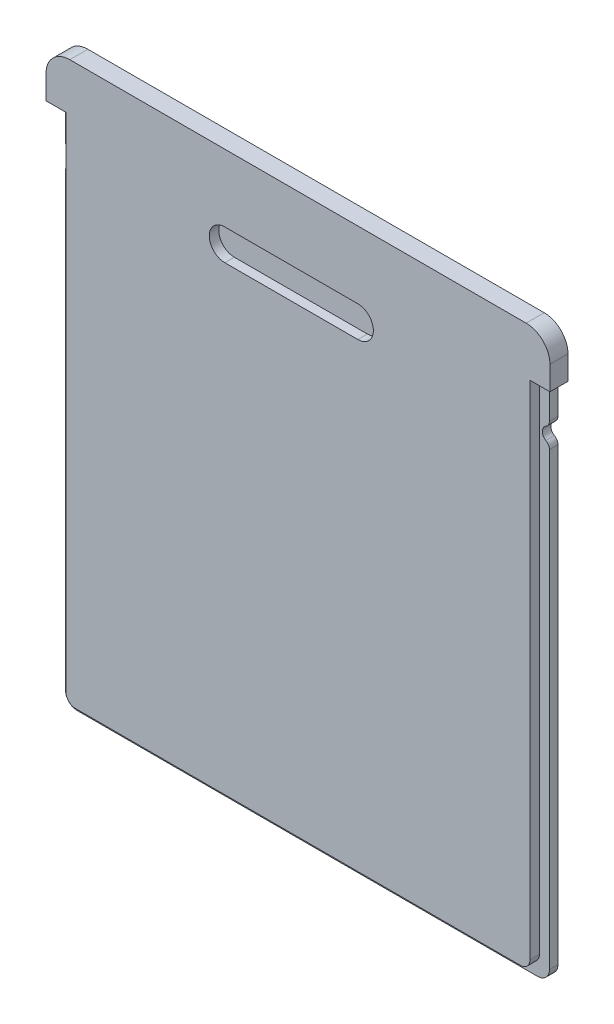
ISO-10303-21;
HEADER;
FILE_DESCRIPTION(('STEP AP214'),'2;1');
FILE_NAME('part.step','',(''),(''),'','','');
FILE_SCHEMA(('AUTOMOTIVE_DESIGN { 1 0 10303 214 1 1 1 1 }'));
ENDSEC;
DATA;
#1=APPLICATION_CONTEXT('core data for automotive mechanical design processes');
#2=APPLICATION_PROTOCOL_DEFINITION('international standard','automotive_design',2000,#1);
#3=PRODUCT_CONTEXT('',#1,'mechanical');
#4=PRODUCT('Part','Part','',(#3));
#5=PRODUCT_RELATED_PRODUCT_CATEGORY('part','',(#4));
#6=PRODUCT_DEFINITION_FORMATION('','',#4);
#7=PRODUCT_DEFINITION_CONTEXT('part definition',#1,'design');
#8=PRODUCT_DEFINITION('design','',#6,#7);
#9=PRODUCT_DEFINITION_SHAPE('','',#8);
#10=(LENGTH_UNIT() NAMED_UNIT(*) SI_UNIT(.MILLI.,.METRE.));
#11=(NAMED_UNIT(*) PLANE_ANGLE_UNIT() SI_UNIT($,.RADIAN.));
#12=(NAMED_UNIT(*) SI_UNIT($,.STERADIAN.) SOLID_ANGLE_UNIT());
#13=UNCERTAINTY_MEASURE_WITH_UNIT(LENGTH_MEASURE(1.E-05),#10,'distance_accuracy_value','');
#14=(GEOMETRIC_REPRESENTATION_CONTEXT(3) GLOBAL_UNCERTAINTY_ASSIGNED_CONTEXT((#13)) GLOBAL_UNIT_ASSIGNED_CONTEXT((#10,
#11,#12)) REPRESENTATION_CONTEXT('',''));
#15=CARTESIAN_POINT('',(0.,0.,0.));
#16=DIRECTION('',(0.,0.,1.));
#17=DIRECTION('',(1.,0.,0.));
#18=AXIS2_PLACEMENT_3D('',#15,#16,#17);
#19=CARTESIAN_POINT('',(101.8,2.5,1.8));
#20=DIRECTION('',(-1.,0.,0.));
#21=DIRECTION('',(0.,0.,1.));
#22=AXIS2_PLACEMENT_3D('',#19,#20,#21);
#23=PLANE('',#22);
#24=DIRECTION('',(0.,1.,0.));
#25=VECTOR('',#24,1.);
#26=CARTESIAN_POINT('',(101.8,2.5,1.8));
#27=LINE('',#26,#25);
#28=CARTESIAN_POINT('',(101.8,102.398076211353,1.8));
#29=VERTEX_POINT('',#28);
#30=CARTESIAN_POINT('',(101.8,109.8,1.8));
#31=VERTEX_POINT('',#30);
#32=EDGE_CURVE('E392',#29,#31,#27,.T.);
#33=ORIENTED_EDGE('',*,*,#32,.F.);
#34=DIRECTION('',(0.,0.,-1.));
#35=VECTOR('',#34,1.);
#36=CARTESIAN_POINT('',(101.8,102.398076211353,1.8));
#37=LINE('',#36,#35);
#38=CARTESIAN_POINT('',(101.8,102.398076211353,0.));
#39=VERTEX_POINT('',#38);
#40=EDGE_CURVE('E511',#29,#39,#37,.T.);
#41=ORIENTED_EDGE('',*,*,#40,.T.);
#42=DIRECTION('',(0.,1.,0.));
#43=VECTOR('',#42,1.);
#44=CARTESIAN_POINT('',(101.8,2.5,0.));
#45=LINE('',#44,#43);
#46=CARTESIAN_POINT('',(101.8,109.8,0.));
#47=VERTEX_POINT('',#46);
#48=EDGE_CURVE('E413',#39,#47,#45,.T.);
#49=ORIENTED_EDGE('',*,*,#48,.T.);
#50=DIRECTION('',(0.,0.,-1.));
#51=VECTOR('',#50,1.);
#52=CARTESIAN_POINT('',(101.8,109.8,1.8));
#53=LINE('',#52,#51);
#54=EDGE_CURVE('E467',#31,#47,#53,.T.);
#55=ORIENTED_EDGE('',*,*,#54,.F.);
#56=EDGE_LOOP('',(#33,#41,#49,#55));
#57=FACE_BOUND('',#56,.T.);
#58=ADVANCED_FACE('F45',(#57),#23,.F.);
#59=CARTESIAN_POINT('',(0.,2.5,1.8));
#60=DIRECTION('',(1.,0.,0.));
#61=DIRECTION('',(0.,0.,-1.));
#62=AXIS2_PLACEMENT_3D('',#59,#60,#61);
#63=PLANE('',#62);
#64=DIRECTION('',(0.,-1.,0.));
#65=VECTOR('',#64,1.);
#66=CARTESIAN_POINT('',(0.,2.5,1.8));
#67=LINE('',#66,#65);
#68=CARTESIAN_POINT('',(0.,97.2019237886467,1.8));
#69=VERTEX_POINT('',#68);
#70=CARTESIAN_POINT('',(0.,2.5,1.8));
#71=VERTEX_POINT('',#70);
#72=EDGE_CURVE('E398',#69,#71,#67,.T.);
#73=ORIENTED_EDGE('',*,*,#72,.F.);
#74=DIRECTION('',(0.,0.,-1.));
#75=VECTOR('',#74,1.);
#76=CARTESIAN_POINT('',(0.,97.2019237886467,1.8));
#77=LINE('',#76,#75);
#78=CARTESIAN_POINT('',(0.,97.2019237886467,0.));
#79=VERTEX_POINT('',#78);
#80=EDGE_CURVE('E515',#69,#79,#77,.T.);
#81=ORIENTED_EDGE('',*,*,#80,.T.);
#82=DIRECTION('',(0.,-1.,0.));
#83=VECTOR('',#82,1.);
#84=CARTESIAN_POINT('',(0.,2.5,0.));
#85=LINE('',#84,#83);
#86=CARTESIAN_POINT('',(0.,2.5,0.));
#87=VERTEX_POINT('',#86);
#88=EDGE_CURVE('E434',#79,#87,#85,.T.);
#89=ORIENTED_EDGE('',*,*,#88,.T.);
#90=DIRECTION('',(0.,0.,-1.));
#91=VECTOR('',#90,1.);
#92=CARTESIAN_POINT('',(0.,2.5,1.8));
#93=LINE('',#92,#91);
#94=EDGE_CURVE('E451',#71,#87,#93,.T.);
#95=ORIENTED_EDGE('',*,*,#94,.F.);
#96=EDGE_LOOP('',(#73,#81,#89,#95));
#97=FACE_BOUND('',#96,.T.);
#98=ADVANCED_FACE('F602',(#97),#63,.F.);
#99=CARTESIAN_POINT('',(99.3,2.5,1.8));
#100=DIRECTION('',(0.,0.,-1.));
#101=DIRECTION('',(-1.,0.,0.));
#102=AXIS2_PLACEMENT_3D('',#99,#100,#101);
#103=CYLINDRICAL_SURFACE('',#102,2.5);
#104=CARTESIAN_POINT('',(99.3,2.5,0.));
#105=DIRECTION('',(0.,0.,1.));
#106=DIRECTION('',(1.,0.,0.));
#107=AXIS2_PLACEMENT_3D('',#104,#105,#106);
#108=CIRCLE('',#107,2.5);
#109=CARTESIAN_POINT('',(99.3,0.,0.));
#110=VERTEX_POINT('',#109);
#111=CARTESIAN_POINT('',(101.8,2.5,0.));
#112=VERTEX_POINT('',#111);
#113=EDGE_CURVE('E387',#110,#112,#108,.T.);
#114=ORIENTED_EDGE('',*,*,#113,.T.);
#115=DIRECTION('',(0.,0.,-1.));
#116=VECTOR('',#115,1.);
#117=CARTESIAN_POINT('',(101.8,2.5,1.8));
#118=LINE('',#117,#116);
#119=CARTESIAN_POINT('',(101.8,2.5,1.8));
#120=VERTEX_POINT('',#119);
#121=EDGE_CURVE('E342',#120,#112,#118,.T.);
#122=ORIENTED_EDGE('',*,*,#121,.F.);
#123=CARTESIAN_POINT('',(99.3,2.5,1.8));
#124=DIRECTION('',(0.,0.,1.));
#125=DIRECTION('',(1.,0.,0.));
#126=AXIS2_PLACEMENT_3D('',#123,#124,#125);
#127=CIRCLE('',#126,2.5);
#128=CARTESIAN_POINT('',(99.3,0.,1.8));
#129=VERTEX_POINT('',#128);
#130=EDGE_CURVE('E388',#129,#120,#127,.T.);
#131=ORIENTED_EDGE('',*,*,#130,.F.);
#132=DIRECTION('',(0.,0.,-1.));
#133=VECTOR('',#132,1.);
#134=CARTESIAN_POINT('',(99.3,0.,1.8));
#135=LINE('',#134,#133);
#136=EDGE_CURVE('E409',#129,#110,#135,.T.);
#137=ORIENTED_EDGE('',*,*,#136,.T.);
#138=EDGE_LOOP('',(#114,#122,#131,#137));
#139=FACE_BOUND('',#138,.T.);
#140=ADVANCED_FACE('F615',(#139),#103,.T.);
#141=CARTESIAN_POINT('',(101.8,97.2019237886467,0.));
#142=VERTEX_POINT('',#141);
#143=EDGE_CURVE('E414',#112,#142,#45,.T.);
#144=ORIENTED_EDGE('',*,*,#143,.T.);
#145=DIRECTION('',(0.,0.,-1.));
#146=VECTOR('',#145,1.);
#147=CARTESIAN_POINT('',(101.8,97.2019237886467,1.8));
#148=LINE('',#147,#146);
#149=CARTESIAN_POINT('',(101.8,97.2019237886467,1.8));
#150=VERTEX_POINT('',#149);
#151=EDGE_CURVE('E477',#142,#150,#148,.F.);
#152=ORIENTED_EDGE('',*,*,#151,.T.);
#153=EDGE_CURVE('E394',#120,#150,#27,.T.);
#154=ORIENTED_EDGE('',*,*,#153,.F.);
#155=ORIENTED_EDGE('',*,*,#121,.T.);
#156=EDGE_LOOP('',(#144,#152,#154,#155));
#157=FACE_BOUND('',#156,.T.);
#158=ADVANCED_FACE('F618',(#157),#23,.F.);
#159=CARTESIAN_POINT('',(101.8,109.8,1.8));
#160=DIRECTION('',(0.,1.,0.));
#161=DIRECTION('',(0.,0.,1.));
#162=AXIS2_PLACEMENT_3D('',#159,#160,#161);
#163=PLANE('',#162);
#164=DIRECTION('',(1.,0.,0.));
#165=VECTOR('',#164,1.);
#166=CARTESIAN_POINT('',(101.8,109.8,0.));
#167=LINE('',#166,#165);
#168=CARTESIAN_POINT('',(103.9,109.8,0.));
#169=VERTEX_POINT('',#168);
#170=EDGE_CURVE('E418',#47,#169,#167,.T.);
#171=ORIENTED_EDGE('',*,*,#170,.T.);
#172=DIRECTION('',(0.,0.,-1.));
#173=VECTOR('',#172,1.);
#174=CARTESIAN_POINT('',(103.9,109.8,1.8));
#175=LINE('',#174,#173);
#176=CARTESIAN_POINT('',(103.9,109.8,3.8));
#177=VERTEX_POINT('',#176);
#178=EDGE_CURVE('E463',#177,#169,#175,.T.);
#179=ORIENTED_EDGE('',*,*,#178,.F.);
#180=DIRECTION('',(1.,0.,0.));
#181=VECTOR('',#180,1.);
#182=CARTESIAN_POINT('',(99.7,109.8,3.8));
#183=LINE('',#182,#181);
#184=CARTESIAN_POINT('',(99.7,109.8,3.8));
#185=VERTEX_POINT('',#184);
#186=EDGE_CURVE('E323',#185,#177,#183,.T.);
#187=ORIENTED_EDGE('',*,*,#186,.F.);
#188=DIRECTION('',(0.,0.,-1.));
#189=VECTOR('',#188,1.);
#190=CARTESIAN_POINT('',(99.7,109.8,3.8));
#191=LINE('',#190,#189);
#192=CARTESIAN_POINT('',(99.7,109.8,1.8));
#193=VERTEX_POINT('',#192);
#194=EDGE_CURVE('E336',#185,#193,#191,.T.);
#195=ORIENTED_EDGE('',*,*,#194,.T.);
#196=DIRECTION('',(1.,0.,0.));
#197=VECTOR('',#196,1.);
#198=CARTESIAN_POINT('',(99.7,109.8,1.8));
#199=LINE('',#198,#197);
#200=EDGE_CURVE('E307',#193,#31,#199,.T.);
#201=ORIENTED_EDGE('',*,*,#200,.T.);
#202=ORIENTED_EDGE('',*,*,#54,.T.);
#203=EDGE_LOOP('',(#171,#179,#187,#195,#201,#202));
#204=FACE_BOUND('',#203,.T.);
#205=ADVANCED_FACE('F574',(#204),#163,.F.);
#206=CARTESIAN_POINT('',(103.9,119.8,1.8));
#207=DIRECTION('',(-1.,0.,0.));
#208=DIRECTION('',(0.,0.,1.));
#209=AXIS2_PLACEMENT_3D('',#206,#207,#208);
#210=PLANE('',#209);
#211=DIRECTION('',(0.,1.,0.));
#212=VECTOR('',#211,1.);
#213=CARTESIAN_POINT('',(103.9,119.8,0.));
#214=LINE('',#213,#212);
#215=CARTESIAN_POINT('',(103.9,114.8,0.));
#216=VERTEX_POINT('',#215);
#217=EDGE_CURVE('E421',#169,#216,#214,.T.);
#218=ORIENTED_EDGE('',*,*,#217,.T.);
#219=DIRECTION('',(0.,0.,-1.));
#220=VECTOR('',#219,1.);
#221=CARTESIAN_POINT('',(103.9,114.8,1.8));
#222=LINE('',#221,#220);
#223=CARTESIAN_POINT('',(103.9,114.8,3.8));
#224=VERTEX_POINT('',#223);
#225=EDGE_CURVE('E11',#216,#224,#222,.F.);
#226=ORIENTED_EDGE('',*,*,#225,.T.);
#227=DIRECTION('',(0.,-1.,0.));
#228=VECTOR('',#227,1.);
#229=CARTESIAN_POINT('',(103.9,119.8,3.8));
#230=LINE('',#229,#228);
#231=EDGE_CURVE('E327',#224,#177,#230,.T.);
#232=ORIENTED_EDGE('',*,*,#231,.T.);
#233=ORIENTED_EDGE('',*,*,#178,.T.);
#234=EDGE_LOOP('',(#218,#226,#232,#233));
#235=FACE_BOUND('',#234,.T.);
#236=ADVANCED_FACE('F570',(#235),#210,.F.);
#237=CARTESIAN_POINT('',(-2.10000000000002,119.8,1.8));
#238=DIRECTION('',(0.,-1.,0.));
#239=DIRECTION('',(1.,0.,0.));
#240=AXIS2_PLACEMENT_3D('',#237,#238,#239);
#241=PLANE('',#240);
#242=DIRECTION('',(-1.,0.,0.));
#243=VECTOR('',#242,1.);
#244=CARTESIAN_POINT('',(-2.10000000000002,119.8,0.));
#245=LINE('',#244,#243);
#246=CARTESIAN_POINT('',(98.9,119.8,0.));
#247=VERTEX_POINT('',#246);
#248=CARTESIAN_POINT('',(2.89999999999998,119.8,0.));
#249=VERTEX_POINT('',#248);
#250=EDGE_CURVE('E424',#247,#249,#245,.T.);
#251=ORIENTED_EDGE('',*,*,#250,.T.);
#252=DIRECTION('',(0.,0.,-1.));
#253=VECTOR('',#252,1.);
#254=CARTESIAN_POINT('',(2.89999999999998,119.8,1.8));
#255=LINE('',#254,#253);
#256=CARTESIAN_POINT('',(2.89999999999998,119.8,3.8));
#257=VERTEX_POINT('',#256);
#258=EDGE_CURVE('E543',#249,#257,#255,.F.);
#259=ORIENTED_EDGE('',*,*,#258,.T.);
#260=DIRECTION('',(1.,0.,0.));
#261=VECTOR('',#260,1.);
#262=CARTESIAN_POINT('',(-2.10000000000002,119.8,3.8));
#263=LINE('',#262,#261);
#264=CARTESIAN_POINT('',(98.9,119.8,3.8));
#265=VERTEX_POINT('',#264);
#266=EDGE_CURVE('E330',#257,#265,#263,.T.);
#267=ORIENTED_EDGE('',*,*,#266,.T.);
#268=DIRECTION('',(0.,0.,-1.));
#269=VECTOR('',#268,1.);
#270=CARTESIAN_POINT('',(98.9,119.8,1.8));
#271=LINE('',#270,#269);
#272=EDGE_CURVE('E539',#265,#247,#271,.T.);
#273=ORIENTED_EDGE('',*,*,#272,.T.);
#274=EDGE_LOOP('',(#251,#259,#267,#273));
#275=FACE_BOUND('',#274,.T.);
#276=ADVANCED_FACE('F565',(#275),#241,.F.);
#277=CARTESIAN_POINT('',(-2.10000000000002,119.8,1.8));
#278=DIRECTION('',(1.,0.,0.));
#279=DIRECTION('',(0.,1.,0.));
#280=AXIS2_PLACEMENT_3D('',#277,#278,#279);
#281=PLANE('',#280);
#282=DIRECTION('',(0.,-1.,0.));
#283=VECTOR('',#282,1.);
#284=CARTESIAN_POINT('',(-2.10000000000002,119.8,3.8));
#285=LINE('',#284,#283);
#286=CARTESIAN_POINT('',(-2.10000000000002,114.8,3.8));
#287=VERTEX_POINT('',#286);
#288=CARTESIAN_POINT('',(-2.10000000000001,109.8,3.8));
#289=VERTEX_POINT('',#288);
#290=EDGE_CURVE('E333',#287,#289,#285,.T.);
#291=ORIENTED_EDGE('',*,*,#290,.F.);
#292=DIRECTION('',(0.,0.,-1.));
#293=VECTOR('',#292,1.);
#294=CARTESIAN_POINT('',(-2.10000000000002,114.8,1.8));
#295=LINE('',#294,#293);
#296=CARTESIAN_POINT('',(-2.10000000000002,114.8,0.));
#297=VERTEX_POINT('',#296);
#298=EDGE_CURVE('E529',#287,#297,#295,.T.);
#299=ORIENTED_EDGE('',*,*,#298,.T.);
#300=DIRECTION('',(0.,-1.,0.));
#301=VECTOR('',#300,1.);
#302=CARTESIAN_POINT('',(-2.10000000000002,119.8,0.));
#303=LINE('',#302,#301);
#304=CARTESIAN_POINT('',(-2.10000000000001,109.8,0.));
#305=VERTEX_POINT('',#304);
#306=EDGE_CURVE('E428',#297,#305,#303,.T.);
#307=ORIENTED_EDGE('',*,*,#306,.T.);
#308=DIRECTION('',(0.,0.,-1.));
#309=VECTOR('',#308,1.);
#310=CARTESIAN_POINT('',(-2.10000000000001,109.8,1.8));
#311=LINE('',#310,#309);
#312=EDGE_CURVE('E459',#289,#305,#311,.T.);
#313=ORIENTED_EDGE('',*,*,#312,.F.);
#314=EDGE_LOOP('',(#291,#299,#307,#313));
#315=FACE_BOUND('',#314,.T.);
#316=ADVANCED_FACE('F556',(#315),#281,.F.);
#317=CARTESIAN_POINT('',(-2.10000000000001,109.8,1.8));
#318=DIRECTION('',(0.,1.,0.));
#319=DIRECTION('',(0.,0.,1.));
#320=AXIS2_PLACEMENT_3D('',#317,#318,#319);
#321=PLANE('',#320);
#322=DIRECTION('',(1.,0.,0.));
#323=VECTOR('',#322,1.);
#324=CARTESIAN_POINT('',(-2.10000000000001,109.8,0.));
#325=LINE('',#324,#323);
#326=CARTESIAN_POINT('',(0.,109.8,0.));
#327=VERTEX_POINT('',#326);
#328=EDGE_CURVE('E431',#305,#327,#325,.T.);
#329=ORIENTED_EDGE('',*,*,#328,.T.);
#330=DIRECTION('',(0.,0.,-1.));
#331=VECTOR('',#330,1.);
#332=CARTESIAN_POINT('',(0.,109.8,1.8));
#333=LINE('',#332,#331);
#334=CARTESIAN_POINT('',(0.,109.8,1.8));
#335=VERTEX_POINT('',#334);
#336=EDGE_CURVE('E455',#335,#327,#333,.T.);
#337=ORIENTED_EDGE('',*,*,#336,.F.);
#338=DIRECTION('',(1.,0.,0.));
#339=VECTOR('',#338,1.);
#340=CARTESIAN_POINT('',(-2.10000000000001,109.8,1.8));
#341=LINE('',#340,#339);
#342=CARTESIAN_POINT('',(2.1,109.8,1.8));
#343=VERTEX_POINT('',#342);
#344=EDGE_CURVE('E337',#335,#343,#341,.T.);
#345=ORIENTED_EDGE('',*,*,#344,.T.);
#346=DIRECTION('',(0.,0.,-1.));
#347=VECTOR('',#346,1.);
#348=CARTESIAN_POINT('',(2.1,109.8,3.8));
#349=LINE('',#348,#347);
#350=CARTESIAN_POINT('',(2.1,109.8,3.8));
#351=VERTEX_POINT('',#350);
#352=EDGE_CURVE('E383',#351,#343,#349,.T.);
#353=ORIENTED_EDGE('',*,*,#352,.F.);
#354=DIRECTION('',(1.,0.,0.));
#355=VECTOR('',#354,1.);
#356=CARTESIAN_POINT('',(-2.10000000000001,109.8,3.8));
#357=LINE('',#356,#355);
#358=EDGE_CURVE('E302',#289,#351,#357,.T.);
#359=ORIENTED_EDGE('',*,*,#358,.F.);
#360=ORIENTED_EDGE('',*,*,#312,.T.);
#361=EDGE_LOOP('',(#329,#337,#345,#353,#359,#360));
#362=FACE_BOUND('',#361,.T.);
#363=ADVANCED_FACE('F698',(#362),#321,.F.);
#364=CARTESIAN_POINT('',(0.,102.398076211353,0.));
#365=VERTEX_POINT('',#364);
#366=EDGE_CURVE('E435',#327,#365,#85,.T.);
#367=ORIENTED_EDGE('',*,*,#366,.T.);
#368=DIRECTION('',(0.,0.,-1.));
#369=VECTOR('',#368,1.);
#370=CARTESIAN_POINT('',(0.,102.398076211353,1.8));
#371=LINE('',#370,#369);
#372=CARTESIAN_POINT('',(0.,102.398076211353,1.8));
#373=VERTEX_POINT('',#372);
#374=EDGE_CURVE('E525',#365,#373,#371,.F.);
#375=ORIENTED_EDGE('',*,*,#374,.T.);
#376=EDGE_CURVE('E399',#335,#373,#67,.T.);
#377=ORIENTED_EDGE('',*,*,#376,.F.);
#378=ORIENTED_EDGE('',*,*,#336,.T.);
#379=EDGE_LOOP('',(#367,#375,#377,#378));
#380=FACE_BOUND('',#379,.T.);
#381=ADVANCED_FACE('F660',(#380),#63,.F.);
#382=CARTESIAN_POINT('',(2.5,2.5,1.8));
#383=DIRECTION('',(0.,0.,-1.));
#384=DIRECTION('',(-1.,0.,0.));
#385=AXIS2_PLACEMENT_3D('',#382,#383,#384);
#386=CYLINDRICAL_SURFACE('',#385,2.5);
#387=CARTESIAN_POINT('',(2.5,2.5,0.));
#388=DIRECTION('',(0.,0.,1.));
#389=DIRECTION('',(-1.,0.,0.));
#390=AXIS2_PLACEMENT_3D('',#387,#388,#389);
#391=CIRCLE('',#390,2.5);
#392=CARTESIAN_POINT('',(2.5,0.,0.));
#393=VERTEX_POINT('',#392);
#394=EDGE_CURVE('E439',#87,#393,#391,.T.);
#395=ORIENTED_EDGE('',*,*,#394,.T.);
#396=DIRECTION('',(0.,0.,-1.));
#397=VECTOR('',#396,1.);
#398=CARTESIAN_POINT('',(2.5,0.,1.8));
#399=LINE('',#398,#397);
#400=CARTESIAN_POINT('',(2.5,0.,1.8));
#401=VERTEX_POINT('',#400);
#402=EDGE_CURVE('E447',#401,#393,#399,.T.);
#403=ORIENTED_EDGE('',*,*,#402,.F.);
#404=CARTESIAN_POINT('',(2.5,2.5,1.8));
#405=DIRECTION('',(0.,0.,1.));
#406=DIRECTION('',(-1.,0.,0.));
#407=AXIS2_PLACEMENT_3D('',#404,#405,#406);
#408=CIRCLE('',#407,2.5);
#409=EDGE_CURVE('E403',#71,#401,#408,.T.);
#410=ORIENTED_EDGE('',*,*,#409,.F.);
#411=ORIENTED_EDGE('',*,*,#94,.T.);
#412=EDGE_LOOP('',(#395,#403,#410,#411));
#413=FACE_BOUND('',#412,.T.);
#414=ADVANCED_FACE('F606',(#413),#386,.T.);
#415=CARTESIAN_POINT('',(2.5,0.,1.8));
#416=DIRECTION('',(0.,1.,0.));
#417=DIRECTION('',(0.,0.,1.));
#418=AXIS2_PLACEMENT_3D('',#415,#416,#417);
#419=PLANE('',#418);
#420=DIRECTION('',(1.,0.,0.));
#421=VECTOR('',#420,1.);
#422=CARTESIAN_POINT('',(2.5,0.,0.));
#423=LINE('',#422,#421);
#424=EDGE_CURVE('E393',#393,#110,#423,.T.);
#425=ORIENTED_EDGE('',*,*,#424,.T.);
#426=ORIENTED_EDGE('',*,*,#136,.F.);
#427=DIRECTION('',(1.,0.,0.));
#428=VECTOR('',#427,1.);
#429=CARTESIAN_POINT('',(2.5,0.,1.8));
#430=LINE('',#429,#428);
#431=EDGE_CURVE('E406',#401,#129,#430,.T.);
#432=ORIENTED_EDGE('',*,*,#431,.F.);
#433=ORIENTED_EDGE('',*,*,#402,.T.);
#434=EDGE_LOOP('',(#425,#426,#432,#433));
#435=FACE_BOUND('',#434,.T.);
#436=ADVANCED_FACE('F611',(#435),#419,.F.);
#437=CARTESIAN_POINT('',(99.3,2.5,1.8));
#438=DIRECTION('',(0.,0.,1.));
#439=DIRECTION('',(1.,0.,0.));
#440=AXIS2_PLACEMENT_3D('',#437,#438,#439);
#441=PLANE('',#440);
#442=ORIENTED_EDGE('',*,*,#153,.T.);
#443=CARTESIAN_POINT('',(100.3,97.2019237886467,1.8));
#444=DIRECTION('',(0.,0.,1.));
#445=DIRECTION('',(1.,0.,0.));
#446=AXIS2_PLACEMENT_3D('',#443,#444,#445);
#447=CIRCLE('',#446,1.5);
#448=CARTESIAN_POINT('',(101.05,98.5009618943234,1.8));
#449=VERTEX_POINT('',#448);
#450=EDGE_CURVE('E490',#150,#449,#447,.T.);
#451=ORIENTED_EDGE('',*,*,#450,.T.);
#452=CARTESIAN_POINT('',(101.8,99.8,1.8));
#453=DIRECTION('',(0.,0.,-1.));
#454=DIRECTION('',(-1.,0.,0.));
#455=AXIS2_PLACEMENT_3D('',#452,#453,#454);
#456=CIRCLE('',#455,1.5);
#457=CARTESIAN_POINT('',(101.05,101.099038105677,1.8));
#458=VERTEX_POINT('',#457);
#459=EDGE_CURVE('E287',#449,#458,#456,.T.);
#460=ORIENTED_EDGE('',*,*,#459,.T.);
#461=CARTESIAN_POINT('',(100.3,102.398076211353,1.8));
#462=DIRECTION('',(0.,0.,1.));
#463=DIRECTION('',(1.,0.,0.));
#464=AXIS2_PLACEMENT_3D('',#461,#462,#463);
#465=CIRCLE('',#464,1.5);
#466=EDGE_CURVE('E487',#458,#29,#465,.T.);
#467=ORIENTED_EDGE('',*,*,#466,.T.);
#468=ORIENTED_EDGE('',*,*,#32,.T.);
#469=ORIENTED_EDGE('',*,*,#200,.F.);
#470=DIRECTION('',(0.,-1.,0.));
#471=VECTOR('',#470,1.);
#472=CARTESIAN_POINT('',(99.7,109.8,1.8));
#473=LINE('',#472,#471);
#474=CARTESIAN_POINT('',(99.7,4.2,1.8));
#475=VERTEX_POINT('',#474);
#476=EDGE_CURVE('E358',#193,#475,#473,.T.);
#477=ORIENTED_EDGE('',*,*,#476,.T.);
#478=CARTESIAN_POINT('',(97.7,4.2,1.8));
#479=DIRECTION('',(0.,0.,1.));
#480=DIRECTION('',(1.,0.,0.));
#481=AXIS2_PLACEMENT_3D('',#478,#479,#480);
#482=CIRCLE('',#481,2.);
#483=CARTESIAN_POINT('',(97.7,2.2,1.8));
#484=VERTEX_POINT('',#483);
#485=EDGE_CURVE('E354',#484,#475,#482,.T.);
#486=ORIENTED_EDGE('',*,*,#485,.F.);
#487=DIRECTION('',(1.,0.,0.));
#488=VECTOR('',#487,1.);
#489=CARTESIAN_POINT('',(4.10000000000001,2.2,1.8));
#490=LINE('',#489,#488);
#491=CARTESIAN_POINT('',(4.10000000000001,2.2,1.8));
#492=VERTEX_POINT('',#491);
#493=EDGE_CURVE('E350',#492,#484,#490,.T.);
#494=ORIENTED_EDGE('',*,*,#493,.F.);
#495=CARTESIAN_POINT('',(4.10000000000001,4.2,1.8));
#496=DIRECTION('',(0.,0.,1.));
#497=DIRECTION('',(1.,0.,0.));
#498=AXIS2_PLACEMENT_3D('',#495,#496,#497);
#499=CIRCLE('',#498,2.);
#500=CARTESIAN_POINT('',(2.10000000000001,4.2,1.8));
#501=VERTEX_POINT('',#500);
#502=EDGE_CURVE('E346',#501,#492,#499,.T.);
#503=ORIENTED_EDGE('',*,*,#502,.F.);
#504=DIRECTION('',(0.,-1.,0.));
#505=VECTOR('',#504,1.);
#506=CARTESIAN_POINT('',(2.1,109.8,1.8));
#507=LINE('',#506,#505);
#508=EDGE_CURVE('E296',#343,#501,#507,.T.);
#509=ORIENTED_EDGE('',*,*,#508,.F.);
#510=ORIENTED_EDGE('',*,*,#344,.F.);
#511=ORIENTED_EDGE('',*,*,#376,.T.);
#512=CARTESIAN_POINT('',(1.5,102.398076211353,1.8));
#513=DIRECTION('',(0.,0.,1.));
#514=DIRECTION('',(1.,0.,0.));
#515=AXIS2_PLACEMENT_3D('',#512,#513,#514);
#516=CIRCLE('',#515,1.5);
#517=CARTESIAN_POINT('',(0.749999999999997,101.099038105677,1.8));
#518=VERTEX_POINT('',#517);
#519=EDGE_CURVE('E481',#373,#518,#516,.T.);
#520=ORIENTED_EDGE('',*,*,#519,.T.);
#521=CARTESIAN_POINT('',(0.,99.8,1.8));
#522=DIRECTION('',(0.,0.,-1.));
#523=DIRECTION('',(-1.,0.,0.));
#524=AXIS2_PLACEMENT_3D('',#521,#522,#523);
#525=CIRCLE('',#524,1.5);
#526=CARTESIAN_POINT('',(0.749999999999997,98.5009618943233,1.8));
#527=VERTEX_POINT('',#526);
#528=EDGE_CURVE('E277',#518,#527,#525,.T.);
#529=ORIENTED_EDGE('',*,*,#528,.T.);
#530=CARTESIAN_POINT('',(1.5,97.2019237886467,1.8));
#531=DIRECTION('',(0.,0.,1.));
#532=DIRECTION('',(1.,0.,0.));
#533=AXIS2_PLACEMENT_3D('',#530,#531,#532);
#534=CIRCLE('',#533,1.5);
#535=EDGE_CURVE('E484',#527,#69,#534,.T.);
#536=ORIENTED_EDGE('',*,*,#535,.T.);
#537=ORIENTED_EDGE('',*,*,#72,.T.);
#538=ORIENTED_EDGE('',*,*,#409,.T.);
#539=ORIENTED_EDGE('',*,*,#431,.T.);
#540=ORIENTED_EDGE('',*,*,#130,.T.);
#541=EDGE_LOOP('',(#442,#451,#460,#467,#468,#469,#477,#486,#494,#503,#509,#510,#511,#520,#529,
#536,#537,#538,#539,#540));
#542=FACE_BOUND('',#541,.T.);
#543=ADVANCED_FACE('F583',(#542),#441,.T.);
#544=CARTESIAN_POINT('',(99.3,2.5,0.));
#545=DIRECTION('',(0.,0.,1.));
#546=DIRECTION('',(1.,0.,0.));
#547=AXIS2_PLACEMENT_3D('',#544,#545,#546);
#548=PLANE('',#547);
#549=ORIENTED_EDGE('',*,*,#306,.F.);
#550=CARTESIAN_POINT('',(2.89999999999999,114.8,0.));
#551=DIRECTION('',(0.,0.,1.));
#552=DIRECTION('',(1.,0.,0.));
#553=AXIS2_PLACEMENT_3D('',#550,#551,#552);
#554=CIRCLE('',#553,5.);
#555=EDGE_CURVE('E536',#297,#249,#554,.F.);
#556=ORIENTED_EDGE('',*,*,#555,.T.);
#557=ORIENTED_EDGE('',*,*,#250,.F.);
#558=CARTESIAN_POINT('',(98.9,114.8,0.));
#559=DIRECTION('',(0.,0.,1.));
#560=DIRECTION('',(1.,0.,0.));
#561=AXIS2_PLACEMENT_3D('',#558,#559,#560);
#562=CIRCLE('',#561,5.);
#563=EDGE_CURVE('E533',#247,#216,#562,.F.);
#564=ORIENTED_EDGE('',*,*,#563,.T.);
#565=ORIENTED_EDGE('',*,*,#217,.F.);
#566=ORIENTED_EDGE('',*,*,#170,.F.);
#567=ORIENTED_EDGE('',*,*,#48,.F.);
#568=CARTESIAN_POINT('',(100.3,102.398076211353,0.));
#569=DIRECTION('',(0.,0.,1.));
#570=DIRECTION('',(1.,0.,0.));
#571=AXIS2_PLACEMENT_3D('',#568,#569,#570);
#572=CIRCLE('',#571,1.5);
#573=CARTESIAN_POINT('',(101.05,101.099038105677,0.));
#574=VERTEX_POINT('',#573);
#575=EDGE_CURVE('E505',#39,#574,#572,.F.);
#576=ORIENTED_EDGE('',*,*,#575,.T.);
#577=CARTESIAN_POINT('',(101.8,99.8,0.));
#578=DIRECTION('',(0.,0.,1.));
#579=DIRECTION('',(1.,0.,0.));
#580=AXIS2_PLACEMENT_3D('',#577,#578,#579);
#581=CIRCLE('',#580,1.5);
#582=CARTESIAN_POINT('',(101.05,98.5009618943234,0.));
#583=VERTEX_POINT('',#582);
#584=EDGE_CURVE('E341',#574,#583,#581,.T.);
#585=ORIENTED_EDGE('',*,*,#584,.T.);
#586=CARTESIAN_POINT('',(100.3,97.2019237886467,0.));
#587=DIRECTION('',(0.,0.,1.));
#588=DIRECTION('',(1.,0.,0.));
#589=AXIS2_PLACEMENT_3D('',#586,#587,#588);
#590=CIRCLE('',#589,1.5);
#591=EDGE_CURVE('E508',#583,#142,#590,.F.);
#592=ORIENTED_EDGE('',*,*,#591,.T.);
#593=ORIENTED_EDGE('',*,*,#143,.F.);
#594=ORIENTED_EDGE('',*,*,#113,.F.);
#595=ORIENTED_EDGE('',*,*,#424,.F.);
#596=ORIENTED_EDGE('',*,*,#394,.F.);
#597=ORIENTED_EDGE('',*,*,#88,.F.);
#598=CARTESIAN_POINT('',(1.5,97.2019237886467,0.));
#599=DIRECTION('',(0.,0.,1.));
#600=DIRECTION('',(1.,0.,0.));
#601=AXIS2_PLACEMENT_3D('',#598,#599,#600);
#602=CIRCLE('',#601,1.5);
#603=CARTESIAN_POINT('',(0.749999999999997,98.5009618943233,0.));
#604=VERTEX_POINT('',#603);
#605=EDGE_CURVE('E502',#79,#604,#602,.F.);
#606=ORIENTED_EDGE('',*,*,#605,.T.);
#607=CARTESIAN_POINT('',(0.,99.8,0.));
#608=DIRECTION('',(0.,0.,-1.));
#609=DIRECTION('',(-1.,0.,0.));
#610=AXIS2_PLACEMENT_3D('',#607,#608,#609);
#611=CIRCLE('',#610,1.5);
#612=CARTESIAN_POINT('',(0.749999999999997,101.099038105677,0.));
#613=VERTEX_POINT('',#612);
#614=EDGE_CURVE('E630',#613,#604,#611,.T.);
#615=ORIENTED_EDGE('',*,*,#614,.F.);
#616=CARTESIAN_POINT('',(1.5,102.398076211353,0.));
#617=DIRECTION('',(0.,0.,1.));
#618=DIRECTION('',(1.,0.,0.));
#619=AXIS2_PLACEMENT_3D('',#616,#617,#618);
#620=CIRCLE('',#619,1.5);
#621=EDGE_CURVE('E499',#613,#365,#620,.F.);
#622=ORIENTED_EDGE('',*,*,#621,.T.);
#623=ORIENTED_EDGE('',*,*,#366,.F.);
#624=ORIENTED_EDGE('',*,*,#328,.F.);
#625=EDGE_LOOP('',(#549,#556,#557,#564,#565,#566,#567,#576,#585,#592,#593,#594,#595,#596,#597,
#606,#615,#622,#623,#624));
#626=FACE_BOUND('',#625,.T.);
#627=ADVANCED_FACE('F562',(#626),#548,.F.);
#628=CARTESIAN_POINT('',(2.1,109.8,3.8));
#629=DIRECTION('',(1.,0.,0.));
#630=DIRECTION('',(0.,1.,0.));
#631=AXIS2_PLACEMENT_3D('',#628,#629,#630);
#632=PLANE('',#631);
#633=ORIENTED_EDGE('',*,*,#508,.T.);
#634=DIRECTION('',(0.,0.,-1.));
#635=VECTOR('',#634,1.);
#636=CARTESIAN_POINT('',(2.10000000000001,4.2,3.8));
#637=LINE('',#636,#635);
#638=CARTESIAN_POINT('',(2.10000000000001,4.2,3.8));
#639=VERTEX_POINT('',#638);
#640=EDGE_CURVE('E379',#639,#501,#637,.T.);
#641=ORIENTED_EDGE('',*,*,#640,.F.);
#642=DIRECTION('',(0.,-1.,0.));
#643=VECTOR('',#642,1.);
#644=CARTESIAN_POINT('',(2.1,109.8,3.8));
#645=LINE('',#644,#643);
#646=EDGE_CURVE('E306',#351,#639,#645,.T.);
#647=ORIENTED_EDGE('',*,*,#646,.F.);
#648=ORIENTED_EDGE('',*,*,#352,.T.);
#649=EDGE_LOOP('',(#633,#641,#647,#648));
#650=FACE_BOUND('',#649,.T.);
#651=ADVANCED_FACE('F709',(#650),#632,.F.);
#652=CARTESIAN_POINT('',(4.10000000000001,4.2,3.8));
#653=DIRECTION('',(0.,0.,-1.));
#654=DIRECTION('',(-1.,0.,0.));
#655=AXIS2_PLACEMENT_3D('',#652,#653,#654);
#656=CYLINDRICAL_SURFACE('',#655,2.);
#657=ORIENTED_EDGE('',*,*,#502,.T.);
#658=DIRECTION('',(0.,0.,-1.));
#659=VECTOR('',#658,1.);
#660=CARTESIAN_POINT('',(4.10000000000001,2.2,3.8));
#661=LINE('',#660,#659);
#662=CARTESIAN_POINT('',(4.10000000000001,2.2,3.8));
#663=VERTEX_POINT('',#662);
#664=EDGE_CURVE('E375',#663,#492,#661,.T.);
#665=ORIENTED_EDGE('',*,*,#664,.F.);
#666=CARTESIAN_POINT('',(4.10000000000001,4.2,3.8));
#667=DIRECTION('',(0.,0.,1.));
#668=DIRECTION('',(1.,0.,0.));
#669=AXIS2_PLACEMENT_3D('',#666,#667,#668);
#670=CIRCLE('',#669,2.);
#671=EDGE_CURVE('E310',#639,#663,#670,.T.);
#672=ORIENTED_EDGE('',*,*,#671,.F.);
#673=ORIENTED_EDGE('',*,*,#640,.T.);
#674=EDGE_LOOP('',(#657,#665,#672,#673));
#675=FACE_BOUND('',#674,.T.);
#676=ADVANCED_FACE('F712',(#675),#656,.T.);
#677=CARTESIAN_POINT('',(4.10000000000001,2.2,3.8));
#678=DIRECTION('',(0.,1.,0.));
#679=DIRECTION('',(-1.,0.,0.));
#680=AXIS2_PLACEMENT_3D('',#677,#678,#679);
#681=PLANE('',#680);
#682=ORIENTED_EDGE('',*,*,#493,.T.);
#683=DIRECTION('',(0.,0.,-1.));
#684=VECTOR('',#683,1.);
#685=CARTESIAN_POINT('',(97.7,2.2,3.8));
#686=LINE('',#685,#684);
#687=CARTESIAN_POINT('',(97.7,2.2,3.8));
#688=VERTEX_POINT('',#687);
#689=EDGE_CURVE('E371',#688,#484,#686,.T.);
#690=ORIENTED_EDGE('',*,*,#689,.F.);
#691=DIRECTION('',(1.,0.,0.));
#692=VECTOR('',#691,1.);
#693=CARTESIAN_POINT('',(4.10000000000001,2.2,3.8));
#694=LINE('',#693,#692);
#695=EDGE_CURVE('E313',#663,#688,#694,.T.);
#696=ORIENTED_EDGE('',*,*,#695,.F.);
#697=ORIENTED_EDGE('',*,*,#664,.T.);
#698=EDGE_LOOP('',(#682,#690,#696,#697));
#699=FACE_BOUND('',#698,.T.);
#700=ADVANCED_FACE('F721',(#699),#681,.F.);
#701=CARTESIAN_POINT('',(97.7,4.2,3.8));
#702=DIRECTION('',(0.,0.,-1.));
#703=DIRECTION('',(-1.,0.,0.));
#704=AXIS2_PLACEMENT_3D('',#701,#702,#703);
#705=CYLINDRICAL_SURFACE('',#704,2.);
#706=ORIENTED_EDGE('',*,*,#485,.T.);
#707=DIRECTION('',(0.,0.,-1.));
#708=VECTOR('',#707,1.);
#709=CARTESIAN_POINT('',(99.7,4.2,3.8));
#710=LINE('',#709,#708);
#711=CARTESIAN_POINT('',(99.7,4.2,3.8));
#712=VERTEX_POINT('',#711);
#713=EDGE_CURVE('E367',#712,#475,#710,.T.);
#714=ORIENTED_EDGE('',*,*,#713,.F.);
#715=CARTESIAN_POINT('',(97.7,4.2,3.8));
#716=DIRECTION('',(0.,0.,1.));
#717=DIRECTION('',(1.,0.,0.));
#718=AXIS2_PLACEMENT_3D('',#715,#716,#717);
#719=CIRCLE('',#718,2.);
#720=EDGE_CURVE('E316',#688,#712,#719,.T.);
#721=ORIENTED_EDGE('',*,*,#720,.F.);
#722=ORIENTED_EDGE('',*,*,#689,.T.);
#723=EDGE_LOOP('',(#706,#714,#721,#722));
#724=FACE_BOUND('',#723,.T.);
#725=ADVANCED_FACE('F730',(#724),#705,.T.);
#726=CARTESIAN_POINT('',(99.7,109.8,3.8));
#727=DIRECTION('',(1.,0.,0.));
#728=DIRECTION('',(0.,1.,0.));
#729=AXIS2_PLACEMENT_3D('',#726,#727,#728);
#730=PLANE('',#729);
#731=ORIENTED_EDGE('',*,*,#476,.F.);
#732=ORIENTED_EDGE('',*,*,#194,.F.);
#733=DIRECTION('',(0.,-1.,0.));
#734=VECTOR('',#733,1.);
#735=CARTESIAN_POINT('',(99.7,109.8,3.8));
#736=LINE('',#735,#734);
#737=EDGE_CURVE('E319',#185,#712,#736,.T.);
#738=ORIENTED_EDGE('',*,*,#737,.T.);
#739=ORIENTED_EDGE('',*,*,#713,.T.);
#740=EDGE_LOOP('',(#731,#732,#738,#739));
#741=FACE_BOUND('',#740,.T.);
#742=ADVANCED_FACE('F580',(#741),#730,.T.);
#743=CARTESIAN_POINT('',(4.10000000000001,4.2,3.8));
#744=DIRECTION('',(0.,0.,1.));
#745=DIRECTION('',(1.,0.,0.));
#746=AXIS2_PLACEMENT_3D('',#743,#744,#745);
#747=PLANE('',#746);
#748=CARTESIAN_POINT('',(35.4968564745008,102.374008173431,3.8));
#749=DIRECTION('',(0.,0.,1.));
#750=DIRECTION('',(1.,0.,0.));
#751=AXIS2_PLACEMENT_3D('',#748,#749,#750);
#752=CIRCLE('',#751,3.25654500593005);
#753=CARTESIAN_POINT('',(35.4968564745008,105.630553179361,3.8));
#754=VERTEX_POINT('',#753);
#755=CARTESIAN_POINT('',(35.4968564745008,99.1174631675006,3.8));
#756=VERTEX_POINT('',#755);
#757=EDGE_CURVE('E250',#754,#756,#752,.T.);
#758=ORIENTED_EDGE('',*,*,#757,.F.);
#759=DIRECTION('',(-1.,0.,0.));
#760=VECTOR('',#759,1.);
#761=CARTESIAN_POINT('',(35.4968564745008,105.630553179361,3.8));
#762=LINE('',#761,#760);
#763=CARTESIAN_POINT('',(63.5031435254992,105.630553179361,3.8));
#764=VERTEX_POINT('',#763);
#765=EDGE_CURVE('E270',#764,#754,#762,.T.);
#766=ORIENTED_EDGE('',*,*,#765,.F.);
#767=CARTESIAN_POINT('',(63.5031435254992,102.374008173431,3.8));
#768=DIRECTION('',(0.,0.,1.));
#769=DIRECTION('',(1.,0.,0.));
#770=AXIS2_PLACEMENT_3D('',#767,#768,#769);
#771=CIRCLE('',#770,3.25654500593005);
#772=CARTESIAN_POINT('',(63.5031435254992,99.1174631675006,3.8));
#773=VERTEX_POINT('',#772);
#774=EDGE_CURVE('E274',#773,#764,#771,.T.);
#775=ORIENTED_EDGE('',*,*,#774,.F.);
#776=DIRECTION('',(1.,0.,0.));
#777=VECTOR('',#776,1.);
#778=CARTESIAN_POINT('',(35.4968564745008,99.1174631675006,3.8));
#779=LINE('',#778,#777);
#780=EDGE_CURVE('E286',#756,#773,#779,.T.);
#781=ORIENTED_EDGE('',*,*,#780,.F.);
#782=EDGE_LOOP('',(#758,#766,#775,#781));
#783=FACE_BOUND('',#782,.T.);
#784=ORIENTED_EDGE('',*,*,#266,.F.);
#785=CARTESIAN_POINT('',(2.89999999999999,114.8,3.8));
#786=DIRECTION('',(0.,0.,1.));
#787=DIRECTION('',(1.,0.,0.));
#788=AXIS2_PLACEMENT_3D('',#785,#786,#787);
#789=CIRCLE('',#788,5.);
#790=EDGE_CURVE('E54',#257,#287,#789,.T.);
#791=ORIENTED_EDGE('',*,*,#790,.T.);
#792=ORIENTED_EDGE('',*,*,#290,.T.);
#793=ORIENTED_EDGE('',*,*,#358,.T.);
#794=ORIENTED_EDGE('',*,*,#646,.T.);
#795=ORIENTED_EDGE('',*,*,#671,.T.);
#796=ORIENTED_EDGE('',*,*,#695,.T.);
#797=ORIENTED_EDGE('',*,*,#720,.T.);
#798=ORIENTED_EDGE('',*,*,#737,.F.);
#799=ORIENTED_EDGE('',*,*,#186,.T.);
#800=ORIENTED_EDGE('',*,*,#231,.F.);
#801=CARTESIAN_POINT('',(98.9,114.8,3.8));
#802=DIRECTION('',(0.,0.,1.));
#803=DIRECTION('',(1.,0.,0.));
#804=AXIS2_PLACEMENT_3D('',#801,#802,#803);
#805=CIRCLE('',#804,5.);
#806=EDGE_CURVE('E66',#224,#265,#805,.T.);
#807=ORIENTED_EDGE('',*,*,#806,.T.);
#808=EDGE_LOOP('',(#784,#791,#792,#793,#794,#795,#796,#797,#798,#799,#800,#807));
#809=FACE_BOUND('',#808,.T.);
#810=ADVANCED_FACE('F550',(#783,#809),#747,.T.);
#811=CARTESIAN_POINT('',(35.4968564745008,102.374008173431,1.8));
#812=DIRECTION('',(0.,0.,1.));
#813=DIRECTION('',(1.,0.,0.));
#814=AXIS2_PLACEMENT_3D('',#811,#812,#813);
#815=CYLINDRICAL_SURFACE('',#814,3.25654500593005);
#816=ORIENTED_EDGE('',*,*,#757,.T.);
#817=DIRECTION('',(0.,0.,1.));
#818=VECTOR('',#817,1.);
#819=CARTESIAN_POINT('',(35.4968564745008,99.1174631675006,1.8));
#820=LINE('',#819,#818);
#821=CARTESIAN_POINT('',(35.4968564745008,99.1174631675006,1.8));
#822=VERTEX_POINT('',#821);
#823=EDGE_CURVE('E243',#822,#756,#820,.T.);
#824=ORIENTED_EDGE('',*,*,#823,.F.);
#825=CARTESIAN_POINT('',(35.4968564745008,102.374008173431,1.8));
#826=DIRECTION('',(0.,0.,1.));
#827=DIRECTION('',(1.,0.,0.));
#828=AXIS2_PLACEMENT_3D('',#825,#826,#827);
#829=CIRCLE('',#828,3.25654500593005);
#830=CARTESIAN_POINT('',(35.4968564745008,105.630553179361,1.8));
#831=VERTEX_POINT('',#830);
#832=EDGE_CURVE('E247',#831,#822,#829,.T.);
#833=ORIENTED_EDGE('',*,*,#832,.F.);
#834=DIRECTION('',(0.,0.,1.));
#835=VECTOR('',#834,1.);
#836=CARTESIAN_POINT('',(35.4968564745008,105.630553179361,1.8));
#837=LINE('',#836,#835);
#838=EDGE_CURVE('E293',#831,#754,#837,.T.);
#839=ORIENTED_EDGE('',*,*,#838,.T.);
#840=EDGE_LOOP('',(#816,#824,#833,#839));
#841=FACE_BOUND('',#840,.T.);
#842=ADVANCED_FACE('F245',(#841),#815,.F.);
#843=CARTESIAN_POINT('',(35.4968564745008,105.630553179361,1.8));
#844=DIRECTION('',(0.,1.,0.));
#845=DIRECTION('',(0.,0.,1.));
#846=AXIS2_PLACEMENT_3D('',#843,#844,#845);
#847=PLANE('',#846);
#848=ORIENTED_EDGE('',*,*,#765,.T.);
#849=ORIENTED_EDGE('',*,*,#838,.F.);
#850=DIRECTION('',(-1.,0.,0.));
#851=VECTOR('',#850,1.);
#852=CARTESIAN_POINT('',(35.4968564745008,105.630553179361,1.8));
#853=LINE('',#852,#851);
#854=CARTESIAN_POINT('',(63.5031435254992,105.630553179361,1.8));
#855=VERTEX_POINT('',#854);
#856=EDGE_CURVE('E256',#855,#831,#853,.T.);
#857=ORIENTED_EDGE('',*,*,#856,.F.);
#858=DIRECTION('',(0.,0.,1.));
#859=VECTOR('',#858,1.);
#860=CARTESIAN_POINT('',(63.5031435254992,105.630553179361,1.8));
#861=LINE('',#860,#859);
#862=EDGE_CURVE('E297',#855,#764,#861,.T.);
#863=ORIENTED_EDGE('',*,*,#862,.T.);
#864=EDGE_LOOP('',(#848,#849,#857,#863));
#865=FACE_BOUND('',#864,.T.);
#866=ADVANCED_FACE('F755',(#865),#847,.F.);
#867=CARTESIAN_POINT('',(63.5031435254992,102.374008173431,1.8));
#868=DIRECTION('',(0.,0.,1.));
#869=DIRECTION('',(1.,0.,0.));
#870=AXIS2_PLACEMENT_3D('',#867,#868,#869);
#871=CYLINDRICAL_SURFACE('',#870,3.25654500593005);
#872=ORIENTED_EDGE('',*,*,#774,.T.);
#873=ORIENTED_EDGE('',*,*,#862,.F.);
#874=CARTESIAN_POINT('',(63.5031435254992,102.374008173431,1.8));
#875=DIRECTION('',(0.,0.,1.));
#876=DIRECTION('',(1.,0.,0.));
#877=AXIS2_PLACEMENT_3D('',#874,#875,#876);
#878=CIRCLE('',#877,3.25654500593005);
#879=CARTESIAN_POINT('',(63.5031435254992,99.1174631675006,1.8));
#880=VERTEX_POINT('',#879);
#881=EDGE_CURVE('E265',#880,#855,#878,.T.);
#882=ORIENTED_EDGE('',*,*,#881,.F.);
#883=DIRECTION('',(0.,0.,1.));
#884=VECTOR('',#883,1.);
#885=CARTESIAN_POINT('',(63.5031435254992,99.1174631675006,1.8));
#886=LINE('',#885,#884);
#887=EDGE_CURVE('E255',#880,#773,#886,.T.);
#888=ORIENTED_EDGE('',*,*,#887,.T.);
#889=EDGE_LOOP('',(#872,#873,#882,#888));
#890=FACE_BOUND('',#889,.T.);
#891=ADVANCED_FACE('F763',(#890),#871,.F.);
#892=CARTESIAN_POINT('',(35.4968564745008,99.1174631675006,1.8));
#893=DIRECTION('',(0.,-1.,0.));
#894=DIRECTION('',(0.,0.,-1.));
#895=AXIS2_PLACEMENT_3D('',#892,#893,#894);
#896=PLANE('',#895);
#897=ORIENTED_EDGE('',*,*,#780,.T.);
#898=ORIENTED_EDGE('',*,*,#887,.F.);
#899=DIRECTION('',(1.,0.,0.));
#900=VECTOR('',#899,1.);
#901=CARTESIAN_POINT('',(35.4968564745008,99.1174631675006,1.8));
#902=LINE('',#901,#900);
#903=EDGE_CURVE('E259',#822,#880,#902,.T.);
#904=ORIENTED_EDGE('',*,*,#903,.F.);
#905=ORIENTED_EDGE('',*,*,#823,.T.);
#906=EDGE_LOOP('',(#897,#898,#904,#905));
#907=FACE_BOUND('',#906,.T.);
#908=ADVANCED_FACE('F260',(#907),#896,.F.);
#909=CARTESIAN_POINT('',(35.4968564745008,102.374008173431,1.8));
#910=DIRECTION('',(0.,0.,1.));
#911=DIRECTION('',(1.,0.,0.));
#912=AXIS2_PLACEMENT_3D('',#909,#910,#911);
#913=PLANE('',#912);
#914=ORIENTED_EDGE('',*,*,#832,.T.);
#915=ORIENTED_EDGE('',*,*,#903,.T.);
#916=ORIENTED_EDGE('',*,*,#881,.T.);
#917=ORIENTED_EDGE('',*,*,#856,.T.);
#918=EDGE_LOOP('',(#914,#915,#916,#917));
#919=FACE_BOUND('',#918,.T.);
#920=ADVANCED_FACE('F267',(#919),#913,.T.);
#921=CARTESIAN_POINT('',(0.,99.8,1.8));
#922=DIRECTION('',(0.,0.,-1.));
#923=DIRECTION('',(-1.,0.,0.));
#924=AXIS2_PLACEMENT_3D('',#921,#922,#923);
#925=CYLINDRICAL_SURFACE('',#924,1.5);
#926=ORIENTED_EDGE('',*,*,#614,.T.);
#927=DIRECTION('',(0.,0.,-1.));
#928=VECTOR('',#927,1.);
#929=CARTESIAN_POINT('',(0.749999999999998,98.5009618943233,1.8));
#930=LINE('',#929,#928);
#931=EDGE_CURVE('E522',#604,#527,#930,.F.);
#932=ORIENTED_EDGE('',*,*,#931,.T.);
#933=ORIENTED_EDGE('',*,*,#528,.F.);
#934=DIRECTION('',(0.,0.,-1.));
#935=VECTOR('',#934,1.);
#936=CARTESIAN_POINT('',(0.749999999999998,101.099038105677,1.8));
#937=LINE('',#936,#935);
#938=EDGE_CURVE('E519',#518,#613,#937,.T.);
#939=ORIENTED_EDGE('',*,*,#938,.T.);
#940=EDGE_LOOP('',(#926,#932,#933,#939));
#941=FACE_BOUND('',#940,.T.);
#942=ADVANCED_FACE('F785',(#941),#925,.F.);
#943=CARTESIAN_POINT('',(101.8,99.8,1.8));
#944=DIRECTION('',(0.,0.,-1.));
#945=DIRECTION('',(-1.,0.,0.));
#946=AXIS2_PLACEMENT_3D('',#943,#944,#945);
#947=CYLINDRICAL_SURFACE('',#946,1.5);
#948=ORIENTED_EDGE('',*,*,#459,.F.);
#949=DIRECTION('',(0.,0.,-1.));
#950=VECTOR('',#949,1.);
#951=CARTESIAN_POINT('',(101.05,98.5009618943234,1.8));
#952=LINE('',#951,#950);
#953=EDGE_CURVE('E496',#449,#583,#952,.T.);
#954=ORIENTED_EDGE('',*,*,#953,.T.);
#955=ORIENTED_EDGE('',*,*,#584,.F.);
#956=DIRECTION('',(0.,0.,-1.));
#957=VECTOR('',#956,1.);
#958=CARTESIAN_POINT('',(101.05,101.099038105677,1.8));
#959=LINE('',#958,#957);
#960=EDGE_CURVE('E493',#574,#458,#959,.F.);
#961=ORIENTED_EDGE('',*,*,#960,.T.);
#962=EDGE_LOOP('',(#948,#954,#955,#961));
#963=FACE_BOUND('',#962,.T.);
#964=ADVANCED_FACE('F626',(#963),#947,.F.);
#965=CARTESIAN_POINT('',(100.3,97.2019237886467,1.8));
#966=DIRECTION('',(0.,0.,-1.));
#967=DIRECTION('',(-1.,0.,0.));
#968=AXIS2_PLACEMENT_3D('',#965,#966,#967);
#969=CYLINDRICAL_SURFACE('',#968,1.5);
#970=ORIENTED_EDGE('',*,*,#591,.F.);
#971=ORIENTED_EDGE('',*,*,#953,.F.);
#972=ORIENTED_EDGE('',*,*,#450,.F.);
#973=ORIENTED_EDGE('',*,*,#151,.F.);
#974=EDGE_LOOP('',(#970,#971,#972,#973));
#975=FACE_BOUND('',#974,.T.);
#976=ADVANCED_FACE('F622',(#975),#969,.T.);
#977=CARTESIAN_POINT('',(100.3,102.398076211353,1.8));
#978=DIRECTION('',(0.,0.,-1.));
#979=DIRECTION('',(-1.,0.,0.));
#980=AXIS2_PLACEMENT_3D('',#977,#978,#979);
#981=CYLINDRICAL_SURFACE('',#980,1.5);
#982=ORIENTED_EDGE('',*,*,#466,.F.);
#983=ORIENTED_EDGE('',*,*,#960,.F.);
#984=ORIENTED_EDGE('',*,*,#575,.F.);
#985=ORIENTED_EDGE('',*,*,#40,.F.);
#986=EDGE_LOOP('',(#982,#983,#984,#985));
#987=FACE_BOUND('',#986,.T.);
#988=ADVANCED_FACE('F643',(#987),#981,.T.);
#989=CARTESIAN_POINT('',(1.5,97.2019237886467,1.8));
#990=DIRECTION('',(0.,0.,-1.));
#991=DIRECTION('',(-1.,0.,0.));
#992=AXIS2_PLACEMENT_3D('',#989,#990,#991);
#993=CYLINDRICAL_SURFACE('',#992,1.5);
#994=ORIENTED_EDGE('',*,*,#535,.F.);
#995=ORIENTED_EDGE('',*,*,#931,.F.);
#996=ORIENTED_EDGE('',*,*,#605,.F.);
#997=ORIENTED_EDGE('',*,*,#80,.F.);
#998=EDGE_LOOP('',(#994,#995,#996,#997));
#999=FACE_BOUND('',#998,.T.);
#1000=ADVANCED_FACE('F641',(#999),#993,.T.);
#1001=CARTESIAN_POINT('',(1.5,102.398076211353,1.8));
#1002=DIRECTION('',(0.,0.,-1.));
#1003=DIRECTION('',(-1.,0.,0.));
#1004=AXIS2_PLACEMENT_3D('',#1001,#1002,#1003);
#1005=CYLINDRICAL_SURFACE('',#1004,1.5);
#1006=ORIENTED_EDGE('',*,*,#621,.F.);
#1007=ORIENTED_EDGE('',*,*,#938,.F.);
#1008=ORIENTED_EDGE('',*,*,#519,.F.);
#1009=ORIENTED_EDGE('',*,*,#374,.F.);
#1010=EDGE_LOOP('',(#1006,#1007,#1008,#1009));
#1011=FACE_BOUND('',#1010,.T.);
#1012=ADVANCED_FACE('F650',(#1011),#1005,.T.);
#1013=CARTESIAN_POINT('',(2.89999999999999,114.8,1.8));
#1014=DIRECTION('',(0.,0.,-1.));
#1015=DIRECTION('',(-1.,0.,0.));
#1016=AXIS2_PLACEMENT_3D('',#1013,#1014,#1015);
#1017=CYLINDRICAL_SURFACE('',#1016,5.);
#1018=ORIENTED_EDGE('',*,*,#790,.F.);
#1019=ORIENTED_EDGE('',*,*,#258,.F.);
#1020=ORIENTED_EDGE('',*,*,#555,.F.);
#1021=ORIENTED_EDGE('',*,*,#298,.F.);
#1022=EDGE_LOOP('',(#1018,#1019,#1020,#1021));
#1023=FACE_BOUND('',#1022,.T.);
#1024=ADVANCED_FACE('F559',(#1023),#1017,.T.);
#1025=CARTESIAN_POINT('',(98.9,114.8,1.8));
#1026=DIRECTION('',(0.,0.,-1.));
#1027=DIRECTION('',(-1.,0.,0.));
#1028=AXIS2_PLACEMENT_3D('',#1025,#1026,#1027);
#1029=CYLINDRICAL_SURFACE('',#1028,5.);
#1030=ORIENTED_EDGE('',*,*,#806,.F.);
#1031=ORIENTED_EDGE('',*,*,#225,.F.);
#1032=ORIENTED_EDGE('',*,*,#563,.F.);
#1033=ORIENTED_EDGE('',*,*,#272,.F.);
#1034=EDGE_LOOP('',(#1030,#1031,#1032,#1033));
#1035=FACE_BOUND('',#1034,.T.);
#1036=ADVANCED_FACE('F47',(#1035),#1029,.T.);
#1037=CLOSED_SHELL('',(#58,#98,#140,#158,#205,#236,#276,#316,#363,#381,#414,#436,#543,#627,#651,
#676,#700,#725,#742,#810,#842,#866,#891,#908,#920,#942,#964,#976,#988,#1000,#1012,#1024,#1036));
#1038=MANIFOLD_SOLID_BREP('B2',#1037);
#1039=ADVANCED_BREP_SHAPE_REPRESENTATION('',(#18,#1038),#14);
#1040=SHAPE_DEFINITION_REPRESENTATION(#9,#1039);
ENDSEC;
END-ISO-10303-21;
